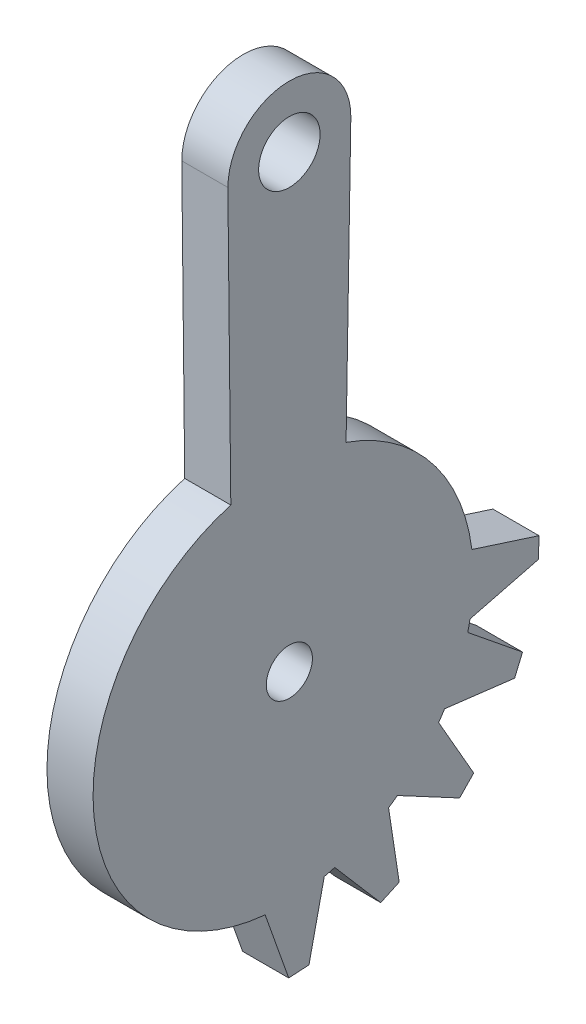
ISO-10303-21;
HEADER;
FILE_DESCRIPTION(('STEP AP214'),'2;1');
FILE_NAME('part.step','',(''),(''),'','','');
FILE_SCHEMA(('AUTOMOTIVE_DESIGN { 1 0 10303 214 1 1 1 1 }'));
ENDSEC;
DATA;
#1=APPLICATION_CONTEXT('core data for automotive mechanical design processes');
#2=APPLICATION_PROTOCOL_DEFINITION('international standard','automotive_design',2000,#1);
#3=PRODUCT_CONTEXT('',#1,'mechanical');
#4=PRODUCT('Part','Part','',(#3));
#5=PRODUCT_RELATED_PRODUCT_CATEGORY('part','',(#4));
#6=PRODUCT_DEFINITION_FORMATION('','',#4);
#7=PRODUCT_DEFINITION_CONTEXT('part definition',#1,'design');
#8=PRODUCT_DEFINITION('design','',#6,#7);
#9=PRODUCT_DEFINITION_SHAPE('','',#8);
#10=(LENGTH_UNIT() NAMED_UNIT(*) SI_UNIT(.MILLI.,.METRE.));
#11=(NAMED_UNIT(*) PLANE_ANGLE_UNIT() SI_UNIT($,.RADIAN.));
#12=(NAMED_UNIT(*) SI_UNIT($,.STERADIAN.) SOLID_ANGLE_UNIT());
#13=UNCERTAINTY_MEASURE_WITH_UNIT(LENGTH_MEASURE(1.E-05),#10,'distance_accuracy_value','');
#14=(GEOMETRIC_REPRESENTATION_CONTEXT(3) GLOBAL_UNCERTAINTY_ASSIGNED_CONTEXT((#13)) GLOBAL_UNIT_ASSIGNED_CONTEXT((#10,
#11,#12)) REPRESENTATION_CONTEXT('',''));
#15=CARTESIAN_POINT('',(0.,0.,0.));
#16=DIRECTION('',(0.,0.,1.));
#17=DIRECTION('',(1.,0.,0.));
#18=AXIS2_PLACEMENT_3D('',#15,#16,#17);
#19=CARTESIAN_POINT('',(3.,0.759761877209441,-71.6977507992739));
#20=DIRECTION('',(0.,0.0105961374690531,-0.999943859359483));
#21=DIRECTION('',(0.,0.999943859359483,0.0105961374690531));
#22=AXIS2_PLACEMENT_3D('',#19,#20,#21);
#23=PLANE('',#22);
#24=DIRECTION('',(0.,-0.999943859359483,-0.0105961374690531));
#25=VECTOR('',#24,1.);
#26=CARTESIAN_POINT('',(0.,0.759761877209441,-71.6977507992739));
#27=LINE('',#26,#25);
#28=CARTESIAN_POINT('',(0.,17.8753281276264,-71.5163817242477));
#29=VERTEX_POINT('',#28);
#30=CARTESIAN_POINT('',(0.,-0.114604955418832,-71.707016230598));
#31=VERTEX_POINT('',#30);
#32=EDGE_CURVE('E236',#29,#31,#27,.T.);
#33=ORIENTED_EDGE('',*,*,#32,.T.);
#34=DIRECTION('',(-1.,0.,0.));
#35=VECTOR('',#34,1.);
#36=CARTESIAN_POINT('',(3.,-0.114604955418832,-71.707016230598));
#37=LINE('',#36,#35);
#38=CARTESIAN_POINT('',(3.,-0.114604955418832,-71.707016230598));
#39=VERTEX_POINT('',#38);
#40=EDGE_CURVE('E11',#39,#31,#37,.T.);
#41=ORIENTED_EDGE('',*,*,#40,.F.);
#42=DIRECTION('',(0.,-0.999943859359483,-0.0105961374690531));
#43=VECTOR('',#42,1.);
#44=CARTESIAN_POINT('',(3.,0.759761877209441,-71.6977507992739));
#45=LINE('',#44,#43);
#46=CARTESIAN_POINT('',(3.,17.8753281276264,-71.5163817242477));
#47=VERTEX_POINT('',#46);
#48=EDGE_CURVE('E295',#47,#39,#45,.T.);
#49=ORIENTED_EDGE('',*,*,#48,.F.);
#50=DIRECTION('',(-1.,0.,0.));
#51=VECTOR('',#50,1.);
#52=CARTESIAN_POINT('',(3.,17.8753281276264,-71.5163817242477));
#53=LINE('',#52,#51);
#54=EDGE_CURVE('E235',#47,#29,#53,.T.);
#55=ORIENTED_EDGE('',*,*,#54,.T.);
#56=EDGE_LOOP('',(#33,#41,#49,#55));
#57=FACE_BOUND('',#56,.T.);
#58=ADVANCED_FACE('F35',(#57),#23,.F.);
#59=CARTESIAN_POINT('',(3.,-12.007302367652,-75.1166889340715));
#60=DIRECTION('',(-1.,0.,0.));
#61=DIRECTION('',(0.,0.,1.));
#62=AXIS2_PLACEMENT_3D('',#59,#60,#61);
#63=CYLINDRICAL_SURFACE('',#62,12.3718276614148);
#64=CARTESIAN_POINT('',(0.,-12.007302367652,-75.1166889340715));
#65=DIRECTION('',(1.,0.,0.));
#66=DIRECTION('',(0.,0.,-1.));
#67=AXIS2_PLACEMENT_3D('',#64,#65,#66);
#68=CIRCLE('',#67,12.3718276614148);
#69=CARTESIAN_POINT('',(0.,-24.3231085983247,-73.9406631808412));
#70=VERTEX_POINT('',#69);
#71=EDGE_CURVE('E239',#31,#70,#68,.T.);
#72=ORIENTED_EDGE('',*,*,#71,.T.);
#73=DIRECTION('',(-1.,0.,0.));
#74=VECTOR('',#73,1.);
#75=CARTESIAN_POINT('',(3.,-24.3231085983247,-73.9406631808412));
#76=LINE('',#75,#74);
#77=CARTESIAN_POINT('',(3.,-24.3231085983247,-73.9406631808412));
#78=VERTEX_POINT('',#77);
#79=EDGE_CURVE('E43',#78,#70,#76,.T.);
#80=ORIENTED_EDGE('',*,*,#79,.F.);
#81=CARTESIAN_POINT('',(3.,-12.007302367652,-75.1166889340715));
#82=DIRECTION('',(1.,0.,0.));
#83=DIRECTION('',(0.,0.,-1.));
#84=AXIS2_PLACEMENT_3D('',#81,#82,#83);
#85=CIRCLE('',#84,12.3718276614148);
#86=EDGE_CURVE('E138',#39,#78,#85,.T.);
#87=ORIENTED_EDGE('',*,*,#86,.F.);
#88=ORIENTED_EDGE('',*,*,#40,.T.);
#89=EDGE_LOOP('',(#72,#80,#87,#88));
#90=FACE_BOUND('',#89,.T.);
#91=ADVANCED_FACE('F344',(#90),#63,.T.);
#92=CARTESIAN_POINT('',(3.,20.5766362320362,-58.0159891382397));
#93=DIRECTION('',(0.,-0.334270138222552,0.942477307256082));
#94=DIRECTION('',(0.,-0.942477307256083,-0.334270138222552));
#95=AXIS2_PLACEMENT_3D('',#92,#93,#94);
#96=PLANE('',#95);
#97=DIRECTION('',(0.,0.942477307256082,0.334270138222552));
#98=VECTOR('',#97,1.);
#99=CARTESIAN_POINT('',(0.,20.5766362320362,-58.0159891382397));
#100=LINE('',#99,#98);
#101=CARTESIAN_POINT('',(0.,-28.6482911116802,-75.4746835179319));
#102=VERTEX_POINT('',#101);
#103=EDGE_CURVE('E242',#102,#70,#100,.T.);
#104=ORIENTED_EDGE('',*,*,#103,.F.);
#105=DIRECTION('',(-1.,0.,0.));
#106=VECTOR('',#105,1.);
#107=CARTESIAN_POINT('',(3.,-28.6482911116802,-75.4746835179319));
#108=LINE('',#107,#106);
#109=CARTESIAN_POINT('',(3.,-28.6482911116802,-75.4746835179319));
#110=VERTEX_POINT('',#109);
#111=EDGE_CURVE('E337',#110,#102,#108,.T.);
#112=ORIENTED_EDGE('',*,*,#111,.F.);
#113=DIRECTION('',(0.,0.942477307256082,0.334270138222552));
#114=VECTOR('',#113,1.);
#115=CARTESIAN_POINT('',(3.,20.5766362320362,-58.0159891382397));
#116=LINE('',#115,#114);
#117=EDGE_CURVE('E343',#110,#78,#116,.T.);
#118=ORIENTED_EDGE('',*,*,#117,.T.);
#119=ORIENTED_EDGE('',*,*,#79,.T.);
#120=EDGE_LOOP('',(#104,#112,#118,#119));
#121=FACE_BOUND('',#120,.T.);
#122=ADVANCED_FACE('F341',(#121),#96,.T.);
#123=CARTESIAN_POINT('',(3.,-33.1463059702363,-2.02999816870955));
#124=DIRECTION('',(0.,-0.998129871640092,-0.0611290384329135));
#125=DIRECTION('',(0.,0.0611290384329135,-0.998129871640092));
#126=AXIS2_PLACEMENT_3D('',#123,#124,#125);
#127=PLANE('',#126);
#128=DIRECTION('',(0.,-0.0611290384329135,0.998129871640093));
#129=VECTOR('',#128,1.);
#130=CARTESIAN_POINT('',(0.,-33.1463059702363,-2.02999816870955));
#131=LINE('',#130,#129);
#132=CARTESIAN_POINT('',(0.,-28.5676102495359,-76.7920603430932));
#133=VERTEX_POINT('',#132);
#134=EDGE_CURVE('E246',#133,#102,#131,.T.);
#135=ORIENTED_EDGE('',*,*,#134,.F.);
#136=DIRECTION('',(-1.,0.,0.));
#137=VECTOR('',#136,1.);
#138=CARTESIAN_POINT('',(3.,-28.5676102495359,-76.7920603430932));
#139=LINE('',#138,#137);
#140=CARTESIAN_POINT('',(3.,-28.5676102495359,-76.7920603430932));
#141=VERTEX_POINT('',#140);
#142=EDGE_CURVE('E335',#141,#133,#139,.T.);
#143=ORIENTED_EDGE('',*,*,#142,.F.);
#144=DIRECTION('',(0.,-0.0611290384329135,0.998129871640093));
#145=VECTOR('',#144,1.);
#146=CARTESIAN_POINT('',(3.,-33.1463059702363,-2.02999816870955));
#147=LINE('',#146,#145);
#148=EDGE_CURVE('E358',#141,#110,#147,.T.);
#149=ORIENTED_EDGE('',*,*,#148,.T.);
#150=ORIENTED_EDGE('',*,*,#111,.T.);
#151=EDGE_LOOP('',(#135,#143,#149,#150));
#152=FACE_BOUND('',#151,.T.);
#153=ADVANCED_FACE('F354',(#152),#127,.T.);
#154=CARTESIAN_POINT('',(3.,-17.5921127347845,-79.2290722151437));
#155=DIRECTION('',(0.,0.216761987432045,0.976224482793025));
#156=DIRECTION('',(0.,-0.976224482793025,0.216761987432045));
#157=AXIS2_PLACEMENT_3D('',#154,#155,#156);
#158=PLANE('',#157);
#159=DIRECTION('',(0.,0.976224482793025,-0.216761987432045));
#160=VECTOR('',#159,1.);
#161=CARTESIAN_POINT('',(0.,-17.5921127347845,-79.2290722151437));
#162=LINE('',#161,#160);
#163=CARTESIAN_POINT('',(0.,-24.0875564279971,-77.7868165567264));
#164=VERTEX_POINT('',#163);
#165=EDGE_CURVE('E249',#133,#164,#162,.T.);
#166=ORIENTED_EDGE('',*,*,#165,.T.);
#167=DIRECTION('',(-1.,0.,0.));
#168=VECTOR('',#167,1.);
#169=CARTESIAN_POINT('',(3.,-24.0875564279971,-77.7868165567264));
#170=LINE('',#169,#168);
#171=CARTESIAN_POINT('',(3.,-24.0875564279971,-77.7868165567264));
#172=VERTEX_POINT('',#171);
#173=EDGE_CURVE('E332',#172,#164,#170,.T.);
#174=ORIENTED_EDGE('',*,*,#173,.F.);
#175=DIRECTION('',(0.,0.976224482793025,-0.216761987432045));
#176=VECTOR('',#175,1.);
#177=CARTESIAN_POINT('',(3.,-17.5921127347845,-79.2290722151437));
#178=LINE('',#177,#176);
#179=EDGE_CURVE('E360',#141,#172,#178,.T.);
#180=ORIENTED_EDGE('',*,*,#179,.F.);
#181=ORIENTED_EDGE('',*,*,#142,.T.);
#182=EDGE_LOOP('',(#166,#174,#180,#181));
#183=FACE_BOUND('',#182,.T.);
#184=ADVANCED_FACE('F687',(#183),#158,.F.);
#185=CARTESIAN_POINT('',(0.,-23.9162791630554,-78.4690599413264));
#186=VERTEX_POINT('',#185);
#187=EDGE_CURVE('E243',#164,#186,#68,.T.);
#188=ORIENTED_EDGE('',*,*,#187,.T.);
#189=DIRECTION('',(-1.,0.,0.));
#190=VECTOR('',#189,1.);
#191=CARTESIAN_POINT('',(3.,-23.9162791630554,-78.4690599413264));
#192=LINE('',#191,#190);
#193=CARTESIAN_POINT('',(3.,-23.9162791630554,-78.4690599413264));
#194=VERTEX_POINT('',#193);
#195=EDGE_CURVE('E330',#194,#186,#192,.T.);
#196=ORIENTED_EDGE('',*,*,#195,.F.);
#197=EDGE_CURVE('E362',#172,#194,#85,.T.);
#198=ORIENTED_EDGE('',*,*,#197,.F.);
#199=ORIENTED_EDGE('',*,*,#173,.T.);
#200=EDGE_LOOP('',(#188,#196,#198,#199));
#201=FACE_BOUND('',#200,.T.);
#202=ADVANCED_FACE('F424',(#201),#63,.T.);
#203=CARTESIAN_POINT('',(3.,28.6224531062577,-33.2712304328036));
#204=DIRECTION('',(0.,-0.652159693828456,0.758081614171966));
#205=DIRECTION('',(0.,-0.758081614171967,-0.652159693828456));
#206=AXIS2_PLACEMENT_3D('',#203,#204,#205);
#207=PLANE('',#206);
#208=DIRECTION('',(0.,0.758081614171967,0.652159693828456));
#209=VECTOR('',#208,1.);
#210=CARTESIAN_POINT('',(0.,28.6224531062577,-33.2712304328036));
#211=LINE('',#210,#209);
#212=CARTESIAN_POINT('',(0.,-27.3952396813291,-81.461927442693));
#213=VERTEX_POINT('',#212);
#214=EDGE_CURVE('E251',#213,#186,#211,.T.);
#215=ORIENTED_EDGE('',*,*,#214,.F.);
#216=DIRECTION('',(-1.,0.,0.));
#217=VECTOR('',#216,1.);
#218=CARTESIAN_POINT('',(3.,-27.3952396813291,-81.461927442693));
#219=LINE('',#218,#217);
#220=CARTESIAN_POINT('',(3.,-27.3952396813291,-81.461927442693));
#221=VERTEX_POINT('',#220);
#222=EDGE_CURVE('E328',#221,#213,#219,.T.);
#223=ORIENTED_EDGE('',*,*,#222,.F.);
#224=DIRECTION('',(0.,0.758081614171967,0.652159693828456));
#225=VECTOR('',#224,1.);
#226=CARTESIAN_POINT('',(3.,28.6224531062577,-33.2712304328036));
#227=LINE('',#226,#225);
#228=EDGE_CURVE('E366',#221,#194,#227,.T.);
#229=ORIENTED_EDGE('',*,*,#228,.T.);
#230=ORIENTED_EDGE('',*,*,#195,.T.);
#231=EDGE_LOOP('',(#215,#223,#229,#230));
#232=FACE_BOUND('',#231,.T.);
#233=ADVANCED_FACE('F668',(#232),#207,.T.);
#234=CARTESIAN_POINT('',(3.,-53.5268902882476,-24.5982202912196));
#235=DIRECTION('',(0.,-0.908646030947399,-0.417567228651314));
#236=DIRECTION('',(0.,0.417567228651314,-0.908646030947399));
#237=AXIS2_PLACEMENT_3D('',#234,#235,#236);
#238=PLANE('',#237);
#239=DIRECTION('',(0.,-0.417567228651314,0.908646030947399));
#240=VECTOR('',#239,1.);
#241=CARTESIAN_POINT('',(0.,-53.5268902882476,-24.5982202912196));
#242=LINE('',#241,#240);
#243=CARTESIAN_POINT('',(0.,-26.8441156186176,-82.6611994587463));
#244=VERTEX_POINT('',#243);
#245=EDGE_CURVE('E254',#244,#213,#242,.T.);
#246=ORIENTED_EDGE('',*,*,#245,.F.);
#247=DIRECTION('',(-1.,0.,0.));
#248=VECTOR('',#247,1.);
#249=CARTESIAN_POINT('',(3.,-26.8441156186176,-82.6611994587463));
#250=LINE('',#249,#248);
#251=CARTESIAN_POINT('',(3.,-26.8441156186176,-82.6611994587463));
#252=VERTEX_POINT('',#251);
#253=EDGE_CURVE('E326',#252,#244,#250,.T.);
#254=ORIENTED_EDGE('',*,*,#253,.F.);
#255=DIRECTION('',(0.,-0.417567228651314,0.908646030947399));
#256=VECTOR('',#255,1.);
#257=CARTESIAN_POINT('',(3.,-53.5268902882476,-24.5982202912196));
#258=LINE('',#257,#256);
#259=EDGE_CURVE('E369',#252,#221,#258,.T.);
#260=ORIENTED_EDGE('',*,*,#259,.T.);
#261=ORIENTED_EDGE('',*,*,#222,.T.);
#262=EDGE_LOOP('',(#246,#254,#260,#261));
#263=FACE_BOUND('',#262,.T.);
#264=ADVANCED_FACE('F658',(#263),#238,.T.);
#265=CARTESIAN_POINT('',(3.,11.6928266269699,-76.7934350584674));
#266=DIRECTION('',(0.,-0.150528425065966,0.988605681375117));
#267=DIRECTION('',(0.,-0.988605681375117,-0.150528425065967));
#268=AXIS2_PLACEMENT_3D('',#265,#266,#267);
#269=PLANE('',#268);
#270=DIRECTION('',(0.,0.988605681375117,0.150528425065967));
#271=VECTOR('',#270,1.);
#272=CARTESIAN_POINT('',(0.,11.6928266269699,-76.7934350584674));
#273=LINE('',#272,#271);
#274=CARTESIAN_POINT('',(0.,-22.3072424517327,-81.970399895886));
#275=VERTEX_POINT('',#274);
#276=EDGE_CURVE('E257',#244,#275,#273,.T.);
#277=ORIENTED_EDGE('',*,*,#276,.T.);
#278=DIRECTION('',(-1.,0.,0.));
#279=VECTOR('',#278,1.);
#280=CARTESIAN_POINT('',(3.,-22.3072424517327,-81.970399895886));
#281=LINE('',#280,#279);
#282=CARTESIAN_POINT('',(3.,-22.3072424517327,-81.970399895886));
#283=VERTEX_POINT('',#282);
#284=EDGE_CURVE('E323',#283,#275,#281,.T.);
#285=ORIENTED_EDGE('',*,*,#284,.F.);
#286=DIRECTION('',(0.,0.988605681375117,0.150528425065967));
#287=VECTOR('',#286,1.);
#288=CARTESIAN_POINT('',(3.,11.6928266269699,-76.7934350584674));
#289=LINE('',#288,#287);
#290=EDGE_CURVE('E372',#252,#283,#289,.T.);
#291=ORIENTED_EDGE('',*,*,#290,.F.);
#292=ORIENTED_EDGE('',*,*,#253,.T.);
#293=EDGE_LOOP('',(#277,#285,#291,#292));
#294=FACE_BOUND('',#293,.T.);
#295=ADVANCED_FACE('F649',(#294),#269,.F.);
#296=CARTESIAN_POINT('',(0.,-21.9010764216485,-82.5447004211524));
#297=VERTEX_POINT('',#296);
#298=EDGE_CURVE('E259',#275,#297,#68,.T.);
#299=ORIENTED_EDGE('',*,*,#298,.T.);
#300=DIRECTION('',(-1.,0.,0.));
#301=VECTOR('',#300,1.);
#302=CARTESIAN_POINT('',(3.,-21.9010764216485,-82.5447004211524));
#303=LINE('',#302,#301);
#304=CARTESIAN_POINT('',(3.,-21.9010764216485,-82.5447004211524));
#305=VERTEX_POINT('',#304);
#306=EDGE_CURVE('E321',#305,#297,#303,.T.);
#307=ORIENTED_EDGE('',*,*,#306,.F.);
#308=EDGE_CURVE('E374',#283,#305,#85,.T.);
#309=ORIENTED_EDGE('',*,*,#308,.F.);
#310=ORIENTED_EDGE('',*,*,#284,.T.);
#311=EDGE_LOOP('',(#299,#307,#309,#310));
#312=FACE_BOUND('',#311,.T.);
#313=ADVANCED_FACE('F612',(#312),#63,.T.);
#314=CARTESIAN_POINT('',(3.,17.2755489065198,-9.23160763092804));
#315=DIRECTION('',(0.,-0.881971469041212,0.471302798418687));
#316=DIRECTION('',(0.,-0.471302798418687,-0.881971469041213));
#317=AXIS2_PLACEMENT_3D('',#314,#315,#316);
#318=PLANE('',#317);
#319=DIRECTION('',(0.,0.471302798418687,0.881971469041212));
#320=VECTOR('',#319,1.);
#321=CARTESIAN_POINT('',(0.,17.2755489065198,-9.23160763092804));
#322=LINE('',#321,#320);
#323=CARTESIAN_POINT('',(0.,-24.0639620492619,-86.5922117466843));
#324=VERTEX_POINT('',#323);
#325=EDGE_CURVE('E260',#324,#297,#322,.T.);
#326=ORIENTED_EDGE('',*,*,#325,.F.);
#327=DIRECTION('',(-1.,0.,0.));
#328=VECTOR('',#327,1.);
#329=CARTESIAN_POINT('',(3.,-24.0639620492619,-86.5922117466843));
#330=LINE('',#329,#328);
#331=CARTESIAN_POINT('',(3.,-24.0639620492619,-86.5922117466843));
#332=VERTEX_POINT('',#331);
#333=EDGE_CURVE('E319',#332,#324,#330,.T.);
#334=ORIENTED_EDGE('',*,*,#333,.F.);
#335=DIRECTION('',(0.,0.471302798418687,0.881971469041212));
#336=VECTOR('',#335,1.);
#337=CARTESIAN_POINT('',(3.,17.2755489065198,-9.23160763092804));
#338=LINE('',#337,#336);
#339=EDGE_CURVE('E375',#332,#305,#338,.T.);
#340=ORIENTED_EDGE('',*,*,#339,.T.);
#341=ORIENTED_EDGE('',*,*,#306,.T.);
#342=EDGE_LOOP('',(#326,#334,#340,#341));
#343=FACE_BOUND('',#342,.T.);
#344=ADVANCED_FACE('F630',(#343),#318,.T.);
#345=CARTESIAN_POINT('',(3.,-54.9485716983326,-56.6185529503125));
#346=DIRECTION('',(0.,-0.69644450879379,-0.717610650820468));
#347=DIRECTION('',(0.,0.717610650820468,-0.69644450879379));
#348=AXIS2_PLACEMENT_3D('',#345,#346,#347);
#349=PLANE('',#348);
#350=DIRECTION('',(0.,-0.717610650820468,0.696444508793791));
#351=VECTOR('',#350,1.);
#352=CARTESIAN_POINT('',(0.,-54.9485716983326,-56.6185529503125));
#353=LINE('',#352,#351);
#354=CARTESIAN_POINT('',(0.,-23.116827144536,-87.5114106224662));
#355=VERTEX_POINT('',#354);
#356=EDGE_CURVE('E263',#355,#324,#353,.T.);
#357=ORIENTED_EDGE('',*,*,#356,.F.);
#358=DIRECTION('',(-1.,0.,0.));
#359=VECTOR('',#358,1.);
#360=CARTESIAN_POINT('',(3.,-23.116827144536,-87.5114106224662));
#361=LINE('',#360,#359);
#362=CARTESIAN_POINT('',(3.,-23.116827144536,-87.5114106224662));
#363=VERTEX_POINT('',#362);
#364=EDGE_CURVE('E317',#363,#355,#361,.T.);
#365=ORIENTED_EDGE('',*,*,#364,.F.);
#366=DIRECTION('',(0.,-0.717610650820468,0.696444508793791));
#367=VECTOR('',#366,1.);
#368=CARTESIAN_POINT('',(3.,-54.9485716983326,-56.6185529503125));
#369=LINE('',#368,#367);
#370=EDGE_CURVE('E378',#363,#332,#369,.T.);
#371=ORIENTED_EDGE('',*,*,#370,.T.);
#372=ORIENTED_EDGE('',*,*,#333,.T.);
#373=EDGE_LOOP('',(#357,#365,#371,#372));
#374=FACE_BOUND('',#373,.T.);
#375=ADVANCED_FACE('F620',(#374),#349,.T.);
#376=CARTESIAN_POINT('',(3.,32.0448529399122,-55.8765064835502));
#377=DIRECTION('',(0.,-0.497489139652021,0.86747020463431));
#378=DIRECTION('',(0.,-0.86747020463431,-0.497489139652021));
#379=AXIS2_PLACEMENT_3D('',#376,#377,#378);
#380=PLANE('',#379);
#381=DIRECTION('',(0.,0.86747020463431,0.497489139652021));
#382=VECTOR('',#381,1.);
#383=CARTESIAN_POINT('',(0.,32.0448529399122,-55.8765064835502));
#384=LINE('',#383,#382);
#385=CARTESIAN_POINT('',(0.,-19.135864493175,-85.2283515919289));
#386=VERTEX_POINT('',#385);
#387=EDGE_CURVE('E266',#355,#386,#384,.T.);
#388=ORIENTED_EDGE('',*,*,#387,.T.);
#389=DIRECTION('',(-1.,0.,0.));
#390=VECTOR('',#389,1.);
#391=CARTESIAN_POINT('',(3.,-19.135864493175,-85.2283515919289));
#392=LINE('',#391,#390);
#393=CARTESIAN_POINT('',(3.,-19.135864493175,-85.2283515919289));
#394=VERTEX_POINT('',#393);
#395=EDGE_CURVE('E314',#394,#386,#392,.T.);
#396=ORIENTED_EDGE('',*,*,#395,.F.);
#397=DIRECTION('',(0.,0.86747020463431,0.497489139652021));
#398=VECTOR('',#397,1.);
#399=CARTESIAN_POINT('',(3.,32.0448529399122,-55.8765064835502));
#400=LINE('',#399,#398);
#401=EDGE_CURVE('E381',#363,#394,#400,.T.);
#402=ORIENTED_EDGE('',*,*,#401,.F.);
#403=ORIENTED_EDGE('',*,*,#364,.T.);
#404=EDGE_LOOP('',(#388,#396,#402,#403));
#405=FACE_BOUND('',#404,.T.);
#406=ADVANCED_FACE('F610',(#405),#380,.F.);
#407=CARTESIAN_POINT('',(0.,-18.5496646709545,-85.617146789616));
#408=VERTEX_POINT('',#407);
#409=EDGE_CURVE('E268',#386,#408,#68,.T.);
#410=ORIENTED_EDGE('',*,*,#409,.T.);
#411=DIRECTION('',(-1.,0.,0.));
#412=VECTOR('',#411,1.);
#413=CARTESIAN_POINT('',(3.,-18.5496646709545,-85.617146789616));
#414=LINE('',#413,#412);
#415=CARTESIAN_POINT('',(3.,-18.5496646709545,-85.617146789616));
#416=VERTEX_POINT('',#415);
#417=EDGE_CURVE('E312',#416,#408,#414,.T.);
#418=ORIENTED_EDGE('',*,*,#417,.F.);
#419=EDGE_CURVE('E383',#394,#416,#85,.T.);
#420=ORIENTED_EDGE('',*,*,#419,.F.);
#421=ORIENTED_EDGE('',*,*,#395,.T.);
#422=EDGE_LOOP('',(#410,#418,#420,#421));
#423=FACE_BOUND('',#422,.T.);
#424=ADVANCED_FACE('F573',(#423),#63,.T.);
#425=CARTESIAN_POINT('',(3.,-8.00581962574028,0.974826172749595));
#426=DIRECTION('',(0.,-0.992668110187328,0.120871928160011));
#427=DIRECTION('',(0.,-0.120871928160011,-0.992668110187328));
#428=AXIS2_PLACEMENT_3D('',#425,#426,#427);
#429=PLANE('',#428);
#430=DIRECTION('',(0.,0.120871928160011,0.992668110187328));
#431=VECTOR('',#430,1.);
#432=CARTESIAN_POINT('',(0.,-8.00581962574028,0.974826172749595));
#433=LINE('',#432,#431);
#434=CARTESIAN_POINT('',(0.,-19.1043657189353,-90.1726631067651));
#435=VERTEX_POINT('',#434);
#436=EDGE_CURVE('E269',#435,#408,#433,.T.);
#437=ORIENTED_EDGE('',*,*,#436,.F.);
#438=DIRECTION('',(-1.,0.,0.));
#439=VECTOR('',#438,1.);
#440=CARTESIAN_POINT('',(3.,-19.1043657189353,-90.1726631067651));
#441=LINE('',#440,#439);
#442=CARTESIAN_POINT('',(3.,-19.1043657189353,-90.1726631067651));
#443=VERTEX_POINT('',#442);
#444=EDGE_CURVE('E310',#443,#435,#441,.T.);
#445=ORIENTED_EDGE('',*,*,#444,.F.);
#446=DIRECTION('',(0.,0.120871928160011,0.992668110187328));
#447=VECTOR('',#446,1.);
#448=CARTESIAN_POINT('',(3.,-8.00581962574028,0.974826172749595));
#449=LINE('',#448,#447);
#450=EDGE_CURVE('E384',#443,#416,#449,.T.);
#451=ORIENTED_EDGE('',*,*,#450,.T.);
#452=ORIENTED_EDGE('',*,*,#417,.T.);
#453=EDGE_LOOP('',(#437,#445,#451,#452));
#454=FACE_BOUND('',#453,.T.);
#455=ADVANCED_FACE('F591',(#454),#429,.T.);
#456=CARTESIAN_POINT('',(3.,-35.3036842811571,-83.3078132731036));
#457=DIRECTION('',(0.,-0.390184296595333,-0.920736778178435));
#458=DIRECTION('',(0.,0.920736778178435,-0.390184296595333));
#459=AXIS2_PLACEMENT_3D('',#456,#457,#458);
#460=PLANE('',#459);
#461=DIRECTION('',(0.,-0.920736778178435,0.390184296595333));
#462=VECTOR('',#461,1.);
#463=CARTESIAN_POINT('',(0.,-35.3036842811571,-83.3078132731036));
#464=LINE('',#463,#462);
#465=CARTESIAN_POINT('',(0.,-17.8891357893341,-90.6876459406442));
#466=VERTEX_POINT('',#465);
#467=EDGE_CURVE('E272',#466,#435,#464,.T.);
#468=ORIENTED_EDGE('',*,*,#467,.F.);
#469=DIRECTION('',(-1.,0.,0.));
#470=VECTOR('',#469,1.);
#471=CARTESIAN_POINT('',(3.,-17.8891357893341,-90.6876459406442));
#472=LINE('',#471,#470);
#473=CARTESIAN_POINT('',(3.,-17.8891357893341,-90.6876459406442));
#474=VERTEX_POINT('',#473);
#475=EDGE_CURVE('E308',#474,#466,#472,.T.);
#476=ORIENTED_EDGE('',*,*,#475,.F.);
#477=DIRECTION('',(0.,-0.920736778178435,0.390184296595333));
#478=VECTOR('',#477,1.);
#479=CARTESIAN_POINT('',(3.,-35.3036842811571,-83.3078132731036));
#480=LINE('',#479,#478);
#481=EDGE_CURVE('E387',#474,#443,#480,.T.);
#482=ORIENTED_EDGE('',*,*,#481,.T.);
#483=ORIENTED_EDGE('',*,*,#444,.T.);
#484=EDGE_LOOP('',(#468,#476,#482,#483));
#485=FACE_BOUND('',#484,.T.);
#486=ADVANCED_FACE('F581',(#485),#460,.T.);
#487=CARTESIAN_POINT('',(3.,33.5420436818957,-27.151642970979));
#488=DIRECTION('',(0.,-0.777261189245586,0.629178069939296));
#489=DIRECTION('',(0.,-0.629178069939296,-0.777261189245586));
#490=AXIS2_PLACEMENT_3D('',#487,#488,#489);
#491=PLANE('',#490);
#492=DIRECTION('',(0.,0.629178069939296,0.777261189245586));
#493=VECTOR('',#492,1.);
#494=CARTESIAN_POINT('',(0.,33.5420436818957,-27.151642970979));
#495=LINE('',#494,#493);
#496=CARTESIAN_POINT('',(0.,-15.0017347188392,-87.1206672153711));
#497=VERTEX_POINT('',#496);
#498=EDGE_CURVE('E275',#466,#497,#495,.T.);
#499=ORIENTED_EDGE('',*,*,#498,.T.);
#500=DIRECTION('',(-1.,0.,0.));
#501=VECTOR('',#500,1.);
#502=CARTESIAN_POINT('',(3.,-15.0017347188392,-87.1206672153711));
#503=LINE('',#502,#501);
#504=CARTESIAN_POINT('',(3.,-15.0017347188392,-87.1206672153711));
#505=VERTEX_POINT('',#504);
#506=EDGE_CURVE('E305',#505,#497,#503,.T.);
#507=ORIENTED_EDGE('',*,*,#506,.F.);
#508=DIRECTION('',(0.,0.629178069939296,0.777261189245586));
#509=VECTOR('',#508,1.);
#510=CARTESIAN_POINT('',(3.,33.5420436818957,-27.151642970979));
#511=LINE('',#510,#509);
#512=EDGE_CURVE('E390',#474,#505,#511,.T.);
#513=ORIENTED_EDGE('',*,*,#512,.F.);
#514=ORIENTED_EDGE('',*,*,#475,.T.);
#515=EDGE_LOOP('',(#499,#507,#513,#514));
#516=FACE_BOUND('',#515,.T.);
#517=ADVANCED_FACE('F571',(#516),#491,.F.);
#518=CARTESIAN_POINT('',(0.,-14.3146706387187,-87.2714481396425));
#519=VERTEX_POINT('',#518);
#520=EDGE_CURVE('E277',#497,#519,#68,.T.);
#521=ORIENTED_EDGE('',*,*,#520,.T.);
#522=DIRECTION('',(-1.,0.,0.));
#523=VECTOR('',#522,1.);
#524=CARTESIAN_POINT('',(3.,-14.3146706387187,-87.2714481396425));
#525=LINE('',#524,#523);
#526=CARTESIAN_POINT('',(3.,-14.3146706387187,-87.2714481396425));
#527=VERTEX_POINT('',#526);
#528=EDGE_CURVE('E303',#527,#519,#525,.T.);
#529=ORIENTED_EDGE('',*,*,#528,.F.);
#530=EDGE_CURVE('E212',#505,#527,#85,.T.);
#531=ORIENTED_EDGE('',*,*,#530,.F.);
#532=ORIENTED_EDGE('',*,*,#506,.T.);
#533=EDGE_LOOP('',(#521,#529,#531,#532));
#534=FACE_BOUND('',#533,.T.);
#535=ADVANCED_FACE('F417',(#534),#63,.T.);
#536=CARTESIAN_POINT('',(3.,-34.2490313406615,-8.68799351888731));
#537=DIRECTION('',(0.,-0.969299422488763,-0.245883365771154));
#538=DIRECTION('',(0.,0.245883365771154,-0.969299422488763));
#539=AXIS2_PLACEMENT_3D('',#536,#537,#538);
#540=PLANE('',#539);
#541=DIRECTION('',(0.,-0.245883365771154,0.969299422488763));
#542=VECTOR('',#541,1.);
#543=CARTESIAN_POINT('',(0.,-34.2490313406615,-8.68799351888731));
#544=LINE('',#543,#542);
#545=CARTESIAN_POINT('',(0.,-13.1862716568326,-91.7197217267907));
#546=VERTEX_POINT('',#545);
#547=EDGE_CURVE('E278',#546,#519,#544,.T.);
#548=ORIENTED_EDGE('',*,*,#547,.F.);
#549=DIRECTION('',(-1.,0.,0.));
#550=VECTOR('',#549,1.);
#551=CARTESIAN_POINT('',(3.,-13.1862716568326,-91.7197217267907));
#552=LINE('',#551,#550);
#553=CARTESIAN_POINT('',(3.,-13.1862716568326,-91.7197217267907));
#554=VERTEX_POINT('',#553);
#555=EDGE_CURVE('E301',#554,#546,#552,.T.);
#556=ORIENTED_EDGE('',*,*,#555,.F.);
#557=DIRECTION('',(0.,-0.245883365771154,0.969299422488763));
#558=VECTOR('',#557,1.);
#559=CARTESIAN_POINT('',(3.,-34.2490313406615,-8.68799351888731));
#560=LINE('',#559,#558);
#561=EDGE_CURVE('E392',#554,#527,#560,.T.);
#562=ORIENTED_EDGE('',*,*,#561,.T.);
#563=ORIENTED_EDGE('',*,*,#528,.T.);
#564=EDGE_LOOP('',(#548,#556,#562,#563));
#565=FACE_BOUND('',#564,.T.);
#566=ADVANCED_FACE('F404',(#565),#540,.T.);
#567=CARTESIAN_POINT('',(3.,-2.8756424950853,-92.0418543433067));
#568=DIRECTION('',(0.,-0.0312275330558549,-0.99951230166479));
#569=DIRECTION('',(0.,0.99951230166479,-0.0312275330558549));
#570=AXIS2_PLACEMENT_3D('',#567,#568,#569);
#571=PLANE('',#570);
#572=DIRECTION('',(0.,-0.99951230166479,0.0312275330558549));
#573=VECTOR('',#572,1.);
#574=CARTESIAN_POINT('',(0.,-2.8756424950853,-92.0418543433067));
#575=LINE('',#574,#573);
#576=CARTESIAN_POINT('',(0.,-11.8670702381702,-91.7609372334333));
#577=VERTEX_POINT('',#576);
#578=EDGE_CURVE('E281',#577,#546,#575,.T.);
#579=ORIENTED_EDGE('',*,*,#578,.F.);
#580=DIRECTION('',(-1.,0.,0.));
#581=VECTOR('',#580,1.);
#582=CARTESIAN_POINT('',(3.,-11.8670702381702,-91.7609372334333));
#583=LINE('',#582,#581);
#584=CARTESIAN_POINT('',(3.,-11.8670702381702,-91.7609372334333));
#585=VERTEX_POINT('',#584);
#586=EDGE_CURVE('E299',#585,#577,#583,.T.);
#587=ORIENTED_EDGE('',*,*,#586,.F.);
#588=DIRECTION('',(0.,-0.99951230166479,0.0312275330558549));
#589=VECTOR('',#588,1.);
#590=CARTESIAN_POINT('',(3.,-2.8756424950853,-92.0418543433067));
#591=LINE('',#590,#589);
#592=EDGE_CURVE('E394',#585,#554,#591,.T.);
#593=ORIENTED_EDGE('',*,*,#592,.T.);
#594=ORIENTED_EDGE('',*,*,#555,.T.);
#595=EDGE_LOOP('',(#579,#587,#593,#594));
#596=FACE_BOUND('',#595,.T.);
#597=ADVANCED_FACE('F398',(#596),#571,.T.);
#598=CARTESIAN_POINT('',(3.,15.9685246936922,-5.13094082244076));
#599=DIRECTION('',(0.,-0.9520598082786,0.305911950502943));
#600=DIRECTION('',(0.,-0.305911950502943,-0.9520598082786));
#601=AXIS2_PLACEMENT_3D('',#598,#599,#600);
#602=PLANE('',#601);
#603=DIRECTION('',(0.,0.305911950502943,0.9520598082786));
#604=VECTOR('',#603,1.);
#605=CARTESIAN_POINT('',(0.,15.9685246936922,-5.13094082244076));
#606=LINE('',#605,#604);
#607=CARTESIAN_POINT('',(0.,-10.463190262753,-87.391779055584));
#608=VERTEX_POINT('',#607);
#609=EDGE_CURVE('E284',#577,#608,#606,.T.);
#610=ORIENTED_EDGE('',*,*,#609,.T.);
#611=DIRECTION('',(-1.,0.,0.));
#612=VECTOR('',#611,1.);
#613=CARTESIAN_POINT('',(3.,-10.463190262753,-87.391779055584));
#614=LINE('',#613,#612);
#615=CARTESIAN_POINT('',(3.,-10.463190262753,-87.391779055584));
#616=VERTEX_POINT('',#615);
#617=EDGE_CURVE('E221',#616,#608,#614,.T.);
#618=ORIENTED_EDGE('',*,*,#617,.F.);
#619=DIRECTION('',(0.,0.305911950502943,0.9520598082786));
#620=VECTOR('',#619,1.);
#621=CARTESIAN_POINT('',(3.,15.9685246936922,-5.13094082244076));
#622=LINE('',#621,#620);
#623=EDGE_CURVE('E207',#585,#616,#622,.T.);
#624=ORIENTED_EDGE('',*,*,#623,.F.);
#625=ORIENTED_EDGE('',*,*,#586,.T.);
#626=EDGE_LOOP('',(#610,#618,#624,#625));
#627=FACE_BOUND('',#626,.T.);
#628=ADVANCED_FACE('F409',(#627),#602,.F.);
#629=CARTESIAN_POINT('',(0.,-0.330822302026468,-79.2059349478005));
#630=VERTEX_POINT('',#629);
#631=EDGE_CURVE('E217',#608,#630,#68,.T.);
#632=ORIENTED_EDGE('',*,*,#631,.T.);
#633=DIRECTION('',(-1.,0.,0.));
#634=VECTOR('',#633,1.);
#635=CARTESIAN_POINT('',(3.,-0.330822302026468,-79.2059349478005));
#636=LINE('',#635,#634);
#637=CARTESIAN_POINT('',(3.,-0.330822302026468,-79.2059349478005));
#638=VERTEX_POINT('',#637);
#639=EDGE_CURVE('E214',#638,#630,#636,.T.);
#640=ORIENTED_EDGE('',*,*,#639,.F.);
#641=EDGE_CURVE('E199',#616,#638,#85,.T.);
#642=ORIENTED_EDGE('',*,*,#641,.F.);
#643=ORIENTED_EDGE('',*,*,#617,.T.);
#644=EDGE_LOOP('',(#632,#640,#642,#643));
#645=FACE_BOUND('',#644,.T.);
#646=ADVANCED_FACE('F215',(#645),#63,.T.);
#647=CARTESIAN_POINT('',(3.,-1.35030359580729,-79.1885510048013));
#648=DIRECTION('',(0.,-0.0170492743307404,-0.999854650559168));
#649=DIRECTION('',(0.,0.999854650559168,-0.0170492743307404));
#650=AXIS2_PLACEMENT_3D('',#647,#648,#649);
#651=PLANE('',#650);
#652=DIRECTION('',(0.,-0.999854650559168,0.0170492743307404));
#653=VECTOR('',#652,1.);
#654=CARTESIAN_POINT('',(0.,-1.35030359580729,-79.1885510048013));
#655=LINE('',#654,#653);
#656=CARTESIAN_POINT('',(0.,17.8753281276264,-79.5163817242477));
#657=VERTEX_POINT('',#656);
#658=EDGE_CURVE('E286',#657,#630,#655,.T.);
#659=ORIENTED_EDGE('',*,*,#658,.F.);
#660=DIRECTION('',(-1.,0.,0.));
#661=VECTOR('',#660,1.);
#662=CARTESIAN_POINT('',(3.,17.8753281276264,-79.5163817242477));
#663=LINE('',#662,#661);
#664=CARTESIAN_POINT('',(3.,17.8753281276264,-79.5163817242477));
#665=VERTEX_POINT('',#664);
#666=EDGE_CURVE('E127',#665,#657,#663,.T.);
#667=ORIENTED_EDGE('',*,*,#666,.F.);
#668=DIRECTION('',(0.,-0.999854650559168,0.0170492743307404));
#669=VECTOR('',#668,1.);
#670=CARTESIAN_POINT('',(3.,-1.35030359580729,-79.1885510048013));
#671=LINE('',#670,#669);
#672=EDGE_CURVE('E204',#665,#638,#671,.T.);
#673=ORIENTED_EDGE('',*,*,#672,.T.);
#674=ORIENTED_EDGE('',*,*,#639,.T.);
#675=EDGE_LOOP('',(#659,#667,#673,#674));
#676=FACE_BOUND('',#675,.T.);
#677=ADVANCED_FACE('F223',(#676),#651,.T.);
#678=CARTESIAN_POINT('',(3.,-11.4046718723736,-75.5163817242477));
#679=DIRECTION('',(-1.,0.,0.));
#680=DIRECTION('',(0.,0.,1.));
#681=AXIS2_PLACEMENT_3D('',#678,#679,#680);
#682=CYLINDRICAL_SURFACE('',#681,1.49999999999972);
#683=CARTESIAN_POINT('',(3.,-11.4046718723736,-75.5163817242477));
#684=DIRECTION('',(1.,0.,0.));
#685=DIRECTION('',(0.,0.,-1.));
#686=AXIS2_PLACEMENT_3D('',#683,#684,#685);
#687=CIRCLE('',#686,1.49999999999972);
#688=CARTESIAN_POINT('',(3.,-11.4046718723736,-77.0163817242474));
#689=VERTEX_POINT('',#688);
#690=EDGE_CURVE('E225',#689,#689,#687,.T.);
#691=ORIENTED_EDGE('',*,*,#690,.T.);
#692=EDGE_LOOP('',(#691));
#693=FACE_BOUND('',#692,.T.);
#694=CARTESIAN_POINT('',(0.,-11.4046718723736,-75.5163817242477));
#695=DIRECTION('',(1.,0.,0.));
#696=DIRECTION('',(0.,0.,-1.));
#697=AXIS2_PLACEMENT_3D('',#694,#695,#696);
#698=CIRCLE('',#697,1.49999999999972);
#699=CARTESIAN_POINT('',(0.,-11.4046718723736,-77.0163817242474));
#700=VERTEX_POINT('',#699);
#701=EDGE_CURVE('E289',#700,#700,#698,.T.);
#702=ORIENTED_EDGE('',*,*,#701,.F.);
#703=EDGE_LOOP('',(#702));
#704=FACE_BOUND('',#703,.T.);
#705=ADVANCED_FACE('F429',(#693,#704),#682,.F.);
#706=CARTESIAN_POINT('',(3.,17.8753281276264,-75.5163817242477));
#707=DIRECTION('',(-1.,0.,0.));
#708=DIRECTION('',(0.,0.,1.));
#709=AXIS2_PLACEMENT_3D('',#706,#707,#708);
#710=CYLINDRICAL_SURFACE('',#709,3.99999999999999);
#711=CARTESIAN_POINT('',(0.,17.8753281276264,-75.5163817242477));
#712=DIRECTION('',(1.,0.,0.));
#713=DIRECTION('',(0.,0.,-1.));
#714=AXIS2_PLACEMENT_3D('',#711,#712,#713);
#715=CIRCLE('',#714,3.99999999999999);
#716=EDGE_CURVE('E130',#657,#29,#715,.T.);
#717=ORIENTED_EDGE('',*,*,#716,.T.);
#718=ORIENTED_EDGE('',*,*,#54,.F.);
#719=CARTESIAN_POINT('',(3.,17.8753281276264,-75.5163817242477));
#720=DIRECTION('',(1.,0.,0.));
#721=DIRECTION('',(0.,0.,-1.));
#722=AXIS2_PLACEMENT_3D('',#719,#720,#721);
#723=CIRCLE('',#722,3.99999999999999);
#724=EDGE_CURVE('E51',#665,#47,#723,.T.);
#725=ORIENTED_EDGE('',*,*,#724,.F.);
#726=ORIENTED_EDGE('',*,*,#666,.T.);
#727=EDGE_LOOP('',(#717,#718,#725,#726));
#728=FACE_BOUND('',#727,.T.);
#729=ADVANCED_FACE('F426',(#728),#710,.T.);
#730=CARTESIAN_POINT('',(3.,17.8753281276264,-75.5163817242477));
#731=DIRECTION('',(-1.,0.,0.));
#732=DIRECTION('',(0.,0.,1.));
#733=AXIS2_PLACEMENT_3D('',#730,#731,#732);
#734=CYLINDRICAL_SURFACE('',#733,2.);
#735=CARTESIAN_POINT('',(3.,17.8753281276264,-75.5163817242477));
#736=DIRECTION('',(1.,0.,0.));
#737=DIRECTION('',(0.,0.,-1.));
#738=AXIS2_PLACEMENT_3D('',#735,#736,#737);
#739=CIRCLE('',#738,2.);
#740=CARTESIAN_POINT('',(3.,17.8753281276264,-77.5163817242477));
#741=VERTEX_POINT('',#740);
#742=EDGE_CURVE('E232',#741,#741,#739,.T.);
#743=ORIENTED_EDGE('',*,*,#742,.T.);
#744=EDGE_LOOP('',(#743));
#745=FACE_BOUND('',#744,.T.);
#746=CARTESIAN_POINT('',(0.,17.8753281276264,-75.5163817242477));
#747=DIRECTION('',(1.,0.,0.));
#748=DIRECTION('',(0.,0.,-1.));
#749=AXIS2_PLACEMENT_3D('',#746,#747,#748);
#750=CIRCLE('',#749,2.);
#751=CARTESIAN_POINT('',(0.,17.8753281276264,-77.5163817242477));
#752=VERTEX_POINT('',#751);
#753=EDGE_CURVE('E292',#752,#752,#750,.T.);
#754=ORIENTED_EDGE('',*,*,#753,.F.);
#755=EDGE_LOOP('',(#754));
#756=FACE_BOUND('',#755,.T.);
#757=ADVANCED_FACE('F428',(#745,#756),#734,.F.);
#758=CARTESIAN_POINT('',(3.,0.,0.));
#759=DIRECTION('',(1.,0.,0.));
#760=DIRECTION('',(0.,0.,-1.));
#761=AXIS2_PLACEMENT_3D('',#758,#759,#760);
#762=PLANE('',#761);
#763=ORIENTED_EDGE('',*,*,#48,.T.);
#764=ORIENTED_EDGE('',*,*,#86,.T.);
#765=ORIENTED_EDGE('',*,*,#117,.F.);
#766=ORIENTED_EDGE('',*,*,#148,.F.);
#767=ORIENTED_EDGE('',*,*,#179,.T.);
#768=ORIENTED_EDGE('',*,*,#197,.T.);
#769=ORIENTED_EDGE('',*,*,#228,.F.);
#770=ORIENTED_EDGE('',*,*,#259,.F.);
#771=ORIENTED_EDGE('',*,*,#290,.T.);
#772=ORIENTED_EDGE('',*,*,#308,.T.);
#773=ORIENTED_EDGE('',*,*,#339,.F.);
#774=ORIENTED_EDGE('',*,*,#370,.F.);
#775=ORIENTED_EDGE('',*,*,#401,.T.);
#776=ORIENTED_EDGE('',*,*,#419,.T.);
#777=ORIENTED_EDGE('',*,*,#450,.F.);
#778=ORIENTED_EDGE('',*,*,#481,.F.);
#779=ORIENTED_EDGE('',*,*,#512,.T.);
#780=ORIENTED_EDGE('',*,*,#530,.T.);
#781=ORIENTED_EDGE('',*,*,#561,.F.);
#782=ORIENTED_EDGE('',*,*,#592,.F.);
#783=ORIENTED_EDGE('',*,*,#623,.T.);
#784=ORIENTED_EDGE('',*,*,#641,.T.);
#785=ORIENTED_EDGE('',*,*,#672,.F.);
#786=ORIENTED_EDGE('',*,*,#724,.T.);
#787=EDGE_LOOP('',(#763,#764,#765,#766,#767,#768,#769,#770,#771,#772,#773,#774,#775,#776,#777,
#778,#779,#780,#781,#782,#783,#784,#785,#786));
#788=FACE_BOUND('',#787,.T.);
#789=ORIENTED_EDGE('',*,*,#690,.F.);
#790=EDGE_LOOP('',(#789));
#791=FACE_BOUND('',#790,.T.);
#792=ORIENTED_EDGE('',*,*,#742,.F.);
#793=EDGE_LOOP('',(#792));
#794=FACE_BOUND('',#793,.T.);
#795=ADVANCED_FACE('F201',(#788,#791,#794),#762,.T.);
#796=CARTESIAN_POINT('',(0.,0.,0.));
#797=DIRECTION('',(1.,0.,0.));
#798=DIRECTION('',(0.,0.,-1.));
#799=AXIS2_PLACEMENT_3D('',#796,#797,#798);
#800=PLANE('',#799);
#801=ORIENTED_EDGE('',*,*,#32,.F.);
#802=ORIENTED_EDGE('',*,*,#716,.F.);
#803=ORIENTED_EDGE('',*,*,#658,.T.);
#804=ORIENTED_EDGE('',*,*,#631,.F.);
#805=ORIENTED_EDGE('',*,*,#609,.F.);
#806=ORIENTED_EDGE('',*,*,#578,.T.);
#807=ORIENTED_EDGE('',*,*,#547,.T.);
#808=ORIENTED_EDGE('',*,*,#520,.F.);
#809=ORIENTED_EDGE('',*,*,#498,.F.);
#810=ORIENTED_EDGE('',*,*,#467,.T.);
#811=ORIENTED_EDGE('',*,*,#436,.T.);
#812=ORIENTED_EDGE('',*,*,#409,.F.);
#813=ORIENTED_EDGE('',*,*,#387,.F.);
#814=ORIENTED_EDGE('',*,*,#356,.T.);
#815=ORIENTED_EDGE('',*,*,#325,.T.);
#816=ORIENTED_EDGE('',*,*,#298,.F.);
#817=ORIENTED_EDGE('',*,*,#276,.F.);
#818=ORIENTED_EDGE('',*,*,#245,.T.);
#819=ORIENTED_EDGE('',*,*,#214,.T.);
#820=ORIENTED_EDGE('',*,*,#187,.F.);
#821=ORIENTED_EDGE('',*,*,#165,.F.);
#822=ORIENTED_EDGE('',*,*,#134,.T.);
#823=ORIENTED_EDGE('',*,*,#103,.T.);
#824=ORIENTED_EDGE('',*,*,#71,.F.);
#825=EDGE_LOOP('',(#801,#802,#803,#804,#805,#806,#807,#808,#809,#810,#811,#812,#813,#814,#815,
#816,#817,#818,#819,#820,#821,#822,#823,#824));
#826=FACE_BOUND('',#825,.T.);
#827=ORIENTED_EDGE('',*,*,#701,.T.);
#828=EDGE_LOOP('',(#827));
#829=FACE_BOUND('',#828,.T.);
#830=ORIENTED_EDGE('',*,*,#753,.T.);
#831=EDGE_LOOP('',(#830));
#832=FACE_BOUND('',#831,.T.);
#833=ADVANCED_FACE('F348',(#826,#829,#832),#800,.F.);
#834=CLOSED_SHELL('',(#58,#91,#122,#153,#184,#202,#233,#264,#295,#313,#344,#375,#406,#424,#455,
#486,#517,#535,#566,#597,#628,#646,#677,#705,#729,#757,#795,#833));
#835=MANIFOLD_SOLID_BREP('B2',#834);
#836=ADVANCED_BREP_SHAPE_REPRESENTATION('',(#18,#835),#14);
#837=SHAPE_DEFINITION_REPRESENTATION(#9,#836);
ENDSEC;
END-ISO-10303-21;
